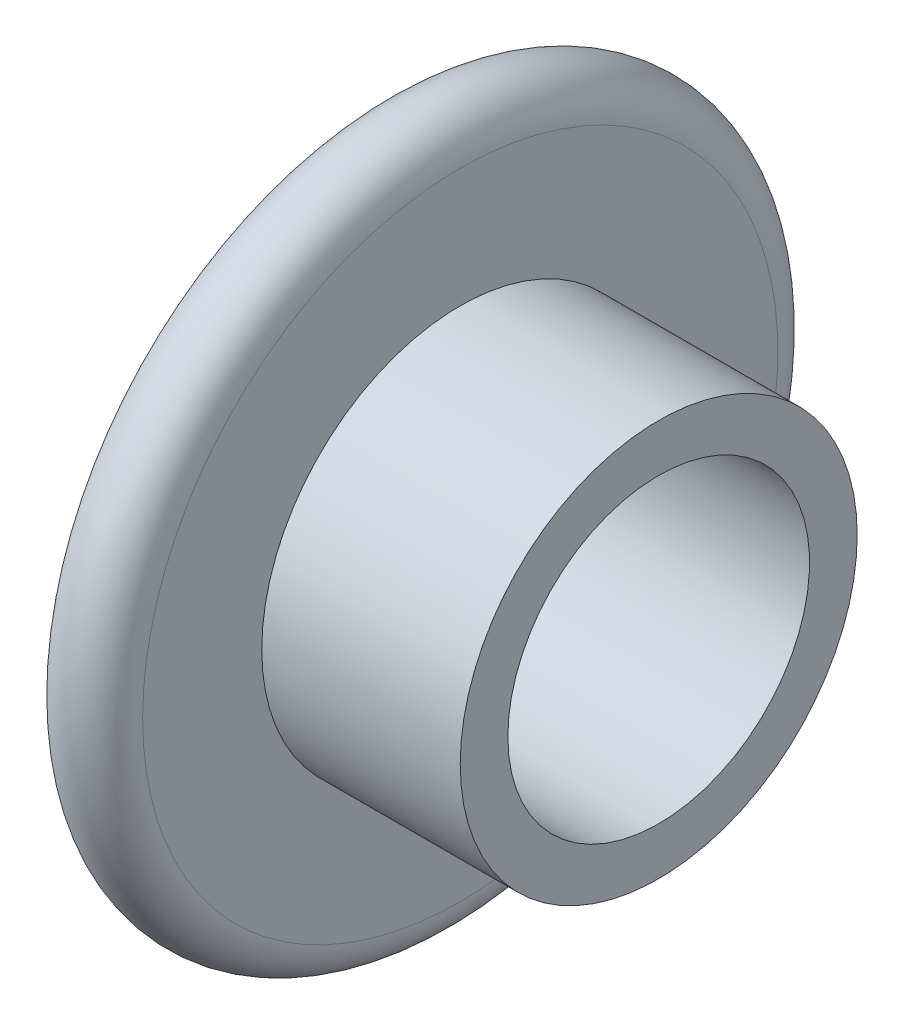
ISO-10303-21;
HEADER;
FILE_DESCRIPTION(('STEP AP214'),'2;1');
FILE_NAME('part.step','',(''),(''),'','','');
FILE_SCHEMA(('AUTOMOTIVE_DESIGN { 1 0 10303 214 1 1 1 1 }'));
ENDSEC;
DATA;
#1=APPLICATION_CONTEXT('core data for automotive mechanical design processes');
#2=APPLICATION_PROTOCOL_DEFINITION('international standard','automotive_design',2000,#1);
#3=PRODUCT_CONTEXT('',#1,'mechanical');
#4=PRODUCT('Part','Part','',(#3));
#5=PRODUCT_RELATED_PRODUCT_CATEGORY('part','',(#4));
#6=PRODUCT_DEFINITION_FORMATION('','',#4);
#7=PRODUCT_DEFINITION_CONTEXT('part definition',#1,'design');
#8=PRODUCT_DEFINITION('design','',#6,#7);
#9=PRODUCT_DEFINITION_SHAPE('','',#8);
#10=(LENGTH_UNIT() NAMED_UNIT(*) SI_UNIT(.MILLI.,.METRE.));
#11=(NAMED_UNIT(*) PLANE_ANGLE_UNIT() SI_UNIT($,.RADIAN.));
#12=(NAMED_UNIT(*) SI_UNIT($,.STERADIAN.) SOLID_ANGLE_UNIT());
#13=UNCERTAINTY_MEASURE_WITH_UNIT(LENGTH_MEASURE(1.E-05),#10,'distance_accuracy_value','');
#14=(GEOMETRIC_REPRESENTATION_CONTEXT(3) GLOBAL_UNCERTAINTY_ASSIGNED_CONTEXT((#13)) GLOBAL_UNIT_ASSIGNED_CONTEXT((#10,
#11,#12)) REPRESENTATION_CONTEXT('',''));
#15=CARTESIAN_POINT('',(0.,0.,0.));
#16=DIRECTION('',(0.,0.,1.));
#17=DIRECTION('',(1.,0.,0.));
#18=AXIS2_PLACEMENT_3D('',#15,#16,#17);
#19=CARTESIAN_POINT('',(0.,25.,0.));
#20=DIRECTION('',(1.,0.,0.));
#21=DIRECTION('',(0.,0.,-1.));
#22=AXIS2_PLACEMENT_3D('',#19,#20,#21);
#23=PLANE('',#22);
#24=CARTESIAN_POINT('',(0.,0.,0.));
#25=DIRECTION('',(-1.,0.,0.));
#26=DIRECTION('',(0.,0.,1.));
#27=AXIS2_PLACEMENT_3D('',#24,#25,#26);
#28=CIRCLE('',#27,19.);
#29=CARTESIAN_POINT('',(0.,0.,19.));
#30=VERTEX_POINT('',#29);
#31=EDGE_CURVE('E10',#30,#30,#28,.T.);
#32=ORIENTED_EDGE('',*,*,#31,.F.);
#33=EDGE_LOOP('',(#32));
#34=FACE_BOUND('',#33,.T.);
#35=CARTESIAN_POINT('',(0.,0.,0.));
#36=DIRECTION('',(-1.,0.,0.));
#37=DIRECTION('',(0.,0.,1.));
#38=AXIS2_PLACEMENT_3D('',#35,#36,#37);
#39=CIRCLE('',#38,25.);
#40=CARTESIAN_POINT('',(0.,0.,25.));
#41=VERTEX_POINT('',#40);
#42=EDGE_CURVE('E63',#41,#41,#39,.T.);
#43=ORIENTED_EDGE('',*,*,#42,.T.);
#44=EDGE_LOOP('',(#43));
#45=FACE_BOUND('',#44,.T.);
#46=ADVANCED_FACE('F35',(#34,#45),#23,.F.);
#47=CARTESIAN_POINT('',(0.,0.,0.));
#48=DIRECTION('',(-1.,0.,0.));
#49=DIRECTION('',(0.,0.,1.));
#50=AXIS2_PLACEMENT_3D('',#47,#48,#49);
#51=CYLINDRICAL_SURFACE('',#50,19.);
#52=CARTESIAN_POINT('',(45.,0.,0.));
#53=DIRECTION('',(-1.,0.,0.));
#54=DIRECTION('',(0.,0.,1.));
#55=AXIS2_PLACEMENT_3D('',#52,#53,#54);
#56=CIRCLE('',#55,19.);
#57=CARTESIAN_POINT('',(45.,0.,19.));
#58=VERTEX_POINT('',#57);
#59=EDGE_CURVE('E41',#58,#58,#56,.T.);
#60=ORIENTED_EDGE('',*,*,#59,.F.);
#61=EDGE_LOOP('',(#60));
#62=FACE_BOUND('',#61,.T.);
#63=ORIENTED_EDGE('',*,*,#31,.T.);
#64=EDGE_LOOP('',(#63));
#65=FACE_BOUND('',#64,.T.);
#66=ADVANCED_FACE('F100',(#62,#65),#51,.F.);
#67=CARTESIAN_POINT('',(45.,19.,0.));
#68=DIRECTION('',(-1.,0.,0.));
#69=DIRECTION('',(0.,0.,1.));
#70=AXIS2_PLACEMENT_3D('',#67,#68,#69);
#71=PLANE('',#70);
#72=CARTESIAN_POINT('',(45.,0.,0.));
#73=DIRECTION('',(-1.,0.,0.));
#74=DIRECTION('',(0.,0.,1.));
#75=AXIS2_PLACEMENT_3D('',#72,#73,#74);
#76=CIRCLE('',#75,25.);
#77=CARTESIAN_POINT('',(45.,0.,25.));
#78=VERTEX_POINT('',#77);
#79=EDGE_CURVE('E45',#78,#78,#76,.T.);
#80=ORIENTED_EDGE('',*,*,#79,.F.);
#81=EDGE_LOOP('',(#80));
#82=FACE_BOUND('',#81,.T.);
#83=ORIENTED_EDGE('',*,*,#59,.T.);
#84=EDGE_LOOP('',(#83));
#85=FACE_BOUND('',#84,.T.);
#86=ADVANCED_FACE('F95',(#82,#85),#71,.F.);
#87=CARTESIAN_POINT('',(0.,0.,0.));
#88=DIRECTION('',(-1.,0.,0.));
#89=DIRECTION('',(0.,0.,1.));
#90=AXIS2_PLACEMENT_3D('',#87,#88,#89);
#91=CYLINDRICAL_SURFACE('',#90,25.);
#92=CARTESIAN_POINT('',(20.,0.,0.));
#93=DIRECTION('',(-1.,0.,0.));
#94=DIRECTION('',(0.,0.,1.));
#95=AXIS2_PLACEMENT_3D('',#92,#93,#94);
#96=CIRCLE('',#95,25.);
#97=CARTESIAN_POINT('',(20.,0.,25.));
#98=VERTEX_POINT('',#97);
#99=EDGE_CURVE('E49',#98,#98,#96,.T.);
#100=ORIENTED_EDGE('',*,*,#99,.F.);
#101=EDGE_LOOP('',(#100));
#102=FACE_BOUND('',#101,.T.);
#103=ORIENTED_EDGE('',*,*,#79,.T.);
#104=EDGE_LOOP('',(#103));
#105=FACE_BOUND('',#104,.T.);
#106=ADVANCED_FACE('F89',(#102,#105),#91,.T.);
#107=CARTESIAN_POINT('',(20.,25.,0.));
#108=DIRECTION('',(-1.,0.,0.));
#109=DIRECTION('',(0.,0.,1.));
#110=AXIS2_PLACEMENT_3D('',#107,#108,#109);
#111=PLANE('',#110);
#112=CARTESIAN_POINT('',(20.,0.,0.));
#113=DIRECTION('',(-1.,0.,0.));
#114=DIRECTION('',(0.,0.,1.));
#115=AXIS2_PLACEMENT_3D('',#112,#113,#114);
#116=CIRCLE('',#115,40.);
#117=CARTESIAN_POINT('',(20.,0.,40.));
#118=VERTEX_POINT('',#117);
#119=EDGE_CURVE('E54',#118,#118,#116,.T.);
#120=ORIENTED_EDGE('',*,*,#119,.F.);
#121=EDGE_LOOP('',(#120));
#122=FACE_BOUND('',#121,.T.);
#123=ORIENTED_EDGE('',*,*,#99,.T.);
#124=EDGE_LOOP('',(#123));
#125=FACE_BOUND('',#124,.T.);
#126=ADVANCED_FACE('F83',(#122,#125),#111,.F.);
#127=CARTESIAN_POINT('',(15.,0.,0.));
#128=DIRECTION('',(-1.,0.,0.));
#129=DIRECTION('',(0.,0.,1.));
#130=AXIS2_PLACEMENT_3D('',#127,#128,#129);
#131=TOROIDAL_SURFACE('',#130,40.,5.);
#132=CARTESIAN_POINT('',(10.,0.,0.));
#133=DIRECTION('',(-1.,0.,0.));
#134=DIRECTION('',(0.,0.,1.));
#135=AXIS2_PLACEMENT_3D('',#132,#133,#134);
#136=CIRCLE('',#135,40.);
#137=CARTESIAN_POINT('',(10.,0.,40.));
#138=VERTEX_POINT('',#137);
#139=EDGE_CURVE('E57',#138,#138,#136,.T.);
#140=ORIENTED_EDGE('',*,*,#139,.F.);
#141=EDGE_LOOP('',(#140));
#142=FACE_BOUND('',#141,.T.);
#143=ORIENTED_EDGE('',*,*,#119,.T.);
#144=EDGE_LOOP('',(#143));
#145=FACE_BOUND('',#144,.T.);
#146=ADVANCED_FACE('F77',(#142,#145),#131,.T.);
#147=CARTESIAN_POINT('',(10.,40.,0.));
#148=DIRECTION('',(1.,0.,0.));
#149=DIRECTION('',(0.,0.,-1.));
#150=AXIS2_PLACEMENT_3D('',#147,#148,#149);
#151=PLANE('',#150);
#152=CARTESIAN_POINT('',(10.,0.,0.));
#153=DIRECTION('',(-1.,0.,0.));
#154=DIRECTION('',(0.,0.,1.));
#155=AXIS2_PLACEMENT_3D('',#152,#153,#154);
#156=CIRCLE('',#155,25.);
#157=CARTESIAN_POINT('',(10.,0.,25.));
#158=VERTEX_POINT('',#157);
#159=EDGE_CURVE('E60',#158,#158,#156,.T.);
#160=ORIENTED_EDGE('',*,*,#159,.F.);
#161=EDGE_LOOP('',(#160));
#162=FACE_BOUND('',#161,.T.);
#163=ORIENTED_EDGE('',*,*,#139,.T.);
#164=EDGE_LOOP('',(#163));
#165=FACE_BOUND('',#164,.T.);
#166=ADVANCED_FACE('F71',(#162,#165),#151,.F.);
#167=CARTESIAN_POINT('',(0.,0.,0.));
#168=DIRECTION('',(-1.,0.,0.));
#169=DIRECTION('',(0.,0.,1.));
#170=AXIS2_PLACEMENT_3D('',#167,#168,#169);
#171=CYLINDRICAL_SURFACE('',#170,25.);
#172=ORIENTED_EDGE('',*,*,#42,.F.);
#173=EDGE_LOOP('',(#172));
#174=FACE_BOUND('',#173,.T.);
#175=ORIENTED_EDGE('',*,*,#159,.T.);
#176=EDGE_LOOP('',(#175));
#177=FACE_BOUND('',#176,.T.);
#178=ADVANCED_FACE('F68',(#174,#177),#171,.T.);
#179=CLOSED_SHELL('',(#46,#66,#86,#106,#126,#146,#166,#178));
#180=MANIFOLD_SOLID_BREP('B2',#179);
#181=ADVANCED_BREP_SHAPE_REPRESENTATION('',(#18,#180),#14);
#182=SHAPE_DEFINITION_REPRESENTATION(#9,#181);
ENDSEC;
END-ISO-10303-21;
